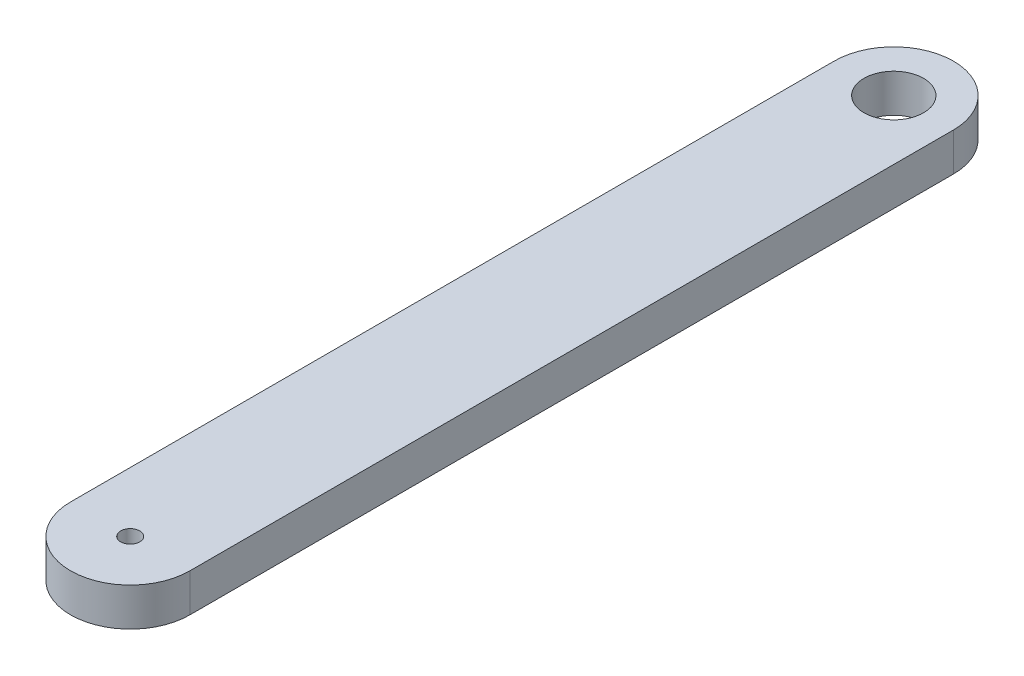
ISO-10303-21;
HEADER;
FILE_DESCRIPTION(('STEP AP214'),'2;1');
FILE_NAME('part.step','',(''),(''),'','','');
FILE_SCHEMA(('AUTOMOTIVE_DESIGN { 1 0 10303 214 1 1 1 1 }'));
ENDSEC;
DATA;
#1=APPLICATION_CONTEXT('core data for automotive mechanical design processes');
#2=APPLICATION_PROTOCOL_DEFINITION('international standard','automotive_design',2000,#1);
#3=PRODUCT_CONTEXT('',#1,'mechanical');
#4=PRODUCT('Part','Part','',(#3));
#5=PRODUCT_RELATED_PRODUCT_CATEGORY('part','',(#4));
#6=PRODUCT_DEFINITION_FORMATION('','',#4);
#7=PRODUCT_DEFINITION_CONTEXT('part definition',#1,'design');
#8=PRODUCT_DEFINITION('design','',#6,#7);
#9=PRODUCT_DEFINITION_SHAPE('','',#8);
#10=(LENGTH_UNIT() NAMED_UNIT(*) SI_UNIT(.MILLI.,.METRE.));
#11=(NAMED_UNIT(*) PLANE_ANGLE_UNIT() SI_UNIT($,.RADIAN.));
#12=(NAMED_UNIT(*) SI_UNIT($,.STERADIAN.) SOLID_ANGLE_UNIT());
#13=UNCERTAINTY_MEASURE_WITH_UNIT(LENGTH_MEASURE(1.E-05),#10,'distance_accuracy_value','');
#14=(GEOMETRIC_REPRESENTATION_CONTEXT(3) GLOBAL_UNCERTAINTY_ASSIGNED_CONTEXT((#13)) GLOBAL_UNIT_ASSIGNED_CONTEXT((#10,
#11,#12)) REPRESENTATION_CONTEXT('',''));
#15=CARTESIAN_POINT('',(0.,0.,0.));
#16=DIRECTION('',(0.,0.,1.));
#17=DIRECTION('',(1.,0.,0.));
#18=AXIS2_PLACEMENT_3D('',#15,#16,#17);
#19=CARTESIAN_POINT('',(12.5,8.,0.));
#20=DIRECTION('',(1.,0.,0.));
#21=DIRECTION('',(0.,0.,-1.));
#22=AXIS2_PLACEMENT_3D('',#19,#20,#21);
#23=PLANE('',#22);
#24=DIRECTION('',(0.,0.,1.));
#25=VECTOR('',#24,1.);
#26=CARTESIAN_POINT('',(12.5,0.,0.));
#27=LINE('',#26,#25);
#28=CARTESIAN_POINT('',(12.5,0.,-160.));
#29=VERTEX_POINT('',#28);
#30=CARTESIAN_POINT('',(12.5,0.,0.));
#31=VERTEX_POINT('',#30);
#32=EDGE_CURVE('E112',#29,#31,#27,.T.);
#33=ORIENTED_EDGE('',*,*,#32,.F.);
#34=DIRECTION('',(0.,-1.,0.));
#35=VECTOR('',#34,1.);
#36=CARTESIAN_POINT('',(12.5,8.,-160.));
#37=LINE('',#36,#35);
#38=CARTESIAN_POINT('',(12.5,8.,-160.));
#39=VERTEX_POINT('',#38);
#40=EDGE_CURVE('E11',#39,#29,#37,.T.);
#41=ORIENTED_EDGE('',*,*,#40,.F.);
#42=DIRECTION('',(0.,0.,1.));
#43=VECTOR('',#42,1.);
#44=CARTESIAN_POINT('',(12.5,8.,0.));
#45=LINE('',#44,#43);
#46=CARTESIAN_POINT('',(12.5,8.,0.));
#47=VERTEX_POINT('',#46);
#48=EDGE_CURVE('E98',#39,#47,#45,.T.);
#49=ORIENTED_EDGE('',*,*,#48,.T.);
#50=DIRECTION('',(0.,-1.,0.));
#51=VECTOR('',#50,1.);
#52=CARTESIAN_POINT('',(12.5,8.,0.));
#53=LINE('',#52,#51);
#54=EDGE_CURVE('E81',#47,#31,#53,.T.);
#55=ORIENTED_EDGE('',*,*,#54,.T.);
#56=EDGE_LOOP('',(#33,#41,#49,#55));
#57=FACE_BOUND('',#56,.T.);
#58=ADVANCED_FACE('F44',(#57),#23,.T.);
#59=CARTESIAN_POINT('',(0.,8.,-160.));
#60=DIRECTION('',(0.,-1.,0.));
#61=DIRECTION('',(0.,0.,-1.));
#62=AXIS2_PLACEMENT_3D('',#59,#60,#61);
#63=CYLINDRICAL_SURFACE('',#62,12.5);
#64=CARTESIAN_POINT('',(0.,0.,-160.));
#65=DIRECTION('',(0.,1.,0.));
#66=DIRECTION('',(0.,0.,1.));
#67=AXIS2_PLACEMENT_3D('',#64,#65,#66);
#68=CIRCLE('',#67,12.5);
#69=CARTESIAN_POINT('',(-12.5,0.,-160.));
#70=VERTEX_POINT('',#69);
#71=EDGE_CURVE('E103',#29,#70,#68,.T.);
#72=ORIENTED_EDGE('',*,*,#71,.T.);
#73=DIRECTION('',(0.,-1.,0.));
#74=VECTOR('',#73,1.);
#75=CARTESIAN_POINT('',(-12.5,8.,-160.));
#76=LINE('',#75,#74);
#77=CARTESIAN_POINT('',(-12.5,8.,-160.));
#78=VERTEX_POINT('',#77);
#79=EDGE_CURVE('E52',#78,#70,#76,.T.);
#80=ORIENTED_EDGE('',*,*,#79,.F.);
#81=CARTESIAN_POINT('',(0.,8.,-160.));
#82=DIRECTION('',(0.,1.,0.));
#83=DIRECTION('',(0.,0.,1.));
#84=AXIS2_PLACEMENT_3D('',#81,#82,#83);
#85=CIRCLE('',#84,12.5);
#86=EDGE_CURVE('E89',#39,#78,#85,.T.);
#87=ORIENTED_EDGE('',*,*,#86,.F.);
#88=ORIENTED_EDGE('',*,*,#40,.T.);
#89=EDGE_LOOP('',(#72,#80,#87,#88));
#90=FACE_BOUND('',#89,.T.);
#91=ADVANCED_FACE('F100',(#90),#63,.T.);
#92=CARTESIAN_POINT('',(-12.5,8.,0.));
#93=DIRECTION('',(1.,0.,0.));
#94=DIRECTION('',(0.,0.,-1.));
#95=AXIS2_PLACEMENT_3D('',#92,#93,#94);
#96=PLANE('',#95);
#97=DIRECTION('',(0.,0.,1.));
#98=VECTOR('',#97,1.);
#99=CARTESIAN_POINT('',(-12.5,0.,0.));
#100=LINE('',#99,#98);
#101=CARTESIAN_POINT('',(-12.5,0.,0.));
#102=VERTEX_POINT('',#101);
#103=EDGE_CURVE('E80',#70,#102,#100,.T.);
#104=ORIENTED_EDGE('',*,*,#103,.T.);
#105=DIRECTION('',(0.,-1.,0.));
#106=VECTOR('',#105,1.);
#107=CARTESIAN_POINT('',(-12.5,8.,0.));
#108=LINE('',#107,#106);
#109=CARTESIAN_POINT('',(-12.5,8.,0.));
#110=VERTEX_POINT('',#109);
#111=EDGE_CURVE('E105',#110,#102,#108,.T.);
#112=ORIENTED_EDGE('',*,*,#111,.F.);
#113=DIRECTION('',(0.,0.,1.));
#114=VECTOR('',#113,1.);
#115=CARTESIAN_POINT('',(-12.5,8.,0.));
#116=LINE('',#115,#114);
#117=EDGE_CURVE('E94',#78,#110,#116,.T.);
#118=ORIENTED_EDGE('',*,*,#117,.F.);
#119=ORIENTED_EDGE('',*,*,#79,.T.);
#120=EDGE_LOOP('',(#104,#112,#118,#119));
#121=FACE_BOUND('',#120,.T.);
#122=ADVANCED_FACE('F101',(#121),#96,.F.);
#123=CARTESIAN_POINT('',(0.,8.,0.));
#124=DIRECTION('',(0.,-1.,0.));
#125=DIRECTION('',(0.,0.,-1.));
#126=AXIS2_PLACEMENT_3D('',#123,#124,#125);
#127=CYLINDRICAL_SURFACE('',#126,2.);
#128=CARTESIAN_POINT('',(0.,8.,0.));
#129=DIRECTION('',(0.,1.,0.));
#130=DIRECTION('',(0.,0.,1.));
#131=AXIS2_PLACEMENT_3D('',#128,#129,#130);
#132=CIRCLE('',#131,2.);
#133=CARTESIAN_POINT('',(0.,8.,2.));
#134=VERTEX_POINT('',#133);
#135=EDGE_CURVE('E102',#134,#134,#132,.T.);
#136=ORIENTED_EDGE('',*,*,#135,.T.);
#137=EDGE_LOOP('',(#136));
#138=FACE_BOUND('',#137,.T.);
#139=CARTESIAN_POINT('',(0.,0.,0.));
#140=DIRECTION('',(0.,1.,0.));
#141=DIRECTION('',(0.,0.,1.));
#142=AXIS2_PLACEMENT_3D('',#139,#140,#141);
#143=CIRCLE('',#142,2.);
#144=CARTESIAN_POINT('',(0.,0.,2.));
#145=VERTEX_POINT('',#144);
#146=EDGE_CURVE('E122',#145,#145,#143,.T.);
#147=ORIENTED_EDGE('',*,*,#146,.F.);
#148=EDGE_LOOP('',(#147));
#149=FACE_BOUND('',#148,.T.);
#150=ADVANCED_FACE('F142',(#138,#149),#127,.F.);
#151=CARTESIAN_POINT('',(0.,8.,0.));
#152=DIRECTION('',(0.,-1.,0.));
#153=DIRECTION('',(0.,0.,-1.));
#154=AXIS2_PLACEMENT_3D('',#151,#152,#153);
#155=CYLINDRICAL_SURFACE('',#154,12.5);
#156=CARTESIAN_POINT('',(0.,0.,0.));
#157=DIRECTION('',(0.,1.,0.));
#158=DIRECTION('',(0.,0.,1.));
#159=AXIS2_PLACEMENT_3D('',#156,#157,#158);
#160=CIRCLE('',#159,12.5);
#161=EDGE_CURVE('E118',#102,#31,#160,.T.);
#162=ORIENTED_EDGE('',*,*,#161,.T.);
#163=ORIENTED_EDGE('',*,*,#54,.F.);
#164=CARTESIAN_POINT('',(0.,8.,0.));
#165=DIRECTION('',(0.,1.,0.));
#166=DIRECTION('',(0.,0.,1.));
#167=AXIS2_PLACEMENT_3D('',#164,#165,#166);
#168=CIRCLE('',#167,12.5);
#169=EDGE_CURVE('E62',#110,#47,#168,.T.);
#170=ORIENTED_EDGE('',*,*,#169,.F.);
#171=ORIENTED_EDGE('',*,*,#111,.T.);
#172=EDGE_LOOP('',(#162,#163,#170,#171));
#173=FACE_BOUND('',#172,.T.);
#174=ADVANCED_FACE('F128',(#173),#155,.T.);
#175=CARTESIAN_POINT('',(0.,8.,-160.));
#176=DIRECTION('',(0.,-1.,0.));
#177=DIRECTION('',(0.,0.,-1.));
#178=AXIS2_PLACEMENT_3D('',#175,#176,#177);
#179=CYLINDRICAL_SURFACE('',#178,6.25);
#180=CARTESIAN_POINT('',(0.,8.,-160.));
#181=DIRECTION('',(0.,1.,0.));
#182=DIRECTION('',(0.,0.,1.));
#183=AXIS2_PLACEMENT_3D('',#180,#181,#182);
#184=CIRCLE('',#183,6.25);
#185=CARTESIAN_POINT('',(0.,8.,-153.75));
#186=VERTEX_POINT('',#185);
#187=EDGE_CURVE('E111',#186,#186,#184,.T.);
#188=ORIENTED_EDGE('',*,*,#187,.T.);
#189=EDGE_LOOP('',(#188));
#190=FACE_BOUND('',#189,.T.);
#191=CARTESIAN_POINT('',(0.,0.,-160.));
#192=DIRECTION('',(0.,1.,0.));
#193=DIRECTION('',(0.,0.,1.));
#194=AXIS2_PLACEMENT_3D('',#191,#192,#193);
#195=CIRCLE('',#194,6.25);
#196=CARTESIAN_POINT('',(0.,0.,-153.75));
#197=VERTEX_POINT('',#196);
#198=EDGE_CURVE('E121',#197,#197,#195,.T.);
#199=ORIENTED_EDGE('',*,*,#198,.F.);
#200=EDGE_LOOP('',(#199));
#201=FACE_BOUND('',#200,.T.);
#202=ADVANCED_FACE('F147',(#190,#201),#179,.F.);
#203=CARTESIAN_POINT('',(0.,8.,0.));
#204=DIRECTION('',(0.,1.,0.));
#205=DIRECTION('',(0.,0.,1.));
#206=AXIS2_PLACEMENT_3D('',#203,#204,#205);
#207=PLANE('',#206);
#208=ORIENTED_EDGE('',*,*,#48,.F.);
#209=ORIENTED_EDGE('',*,*,#86,.T.);
#210=ORIENTED_EDGE('',*,*,#117,.T.);
#211=ORIENTED_EDGE('',*,*,#169,.T.);
#212=EDGE_LOOP('',(#208,#209,#210,#211));
#213=FACE_BOUND('',#212,.T.);
#214=ORIENTED_EDGE('',*,*,#135,.F.);
#215=EDGE_LOOP('',(#214));
#216=FACE_BOUND('',#215,.T.);
#217=ORIENTED_EDGE('',*,*,#187,.F.);
#218=EDGE_LOOP('',(#217));
#219=FACE_BOUND('',#218,.T.);
#220=ADVANCED_FACE('F95',(#213,#216,#219),#207,.T.);
#221=CARTESIAN_POINT('',(0.,0.,0.));
#222=DIRECTION('',(0.,1.,0.));
#223=DIRECTION('',(0.,0.,1.));
#224=AXIS2_PLACEMENT_3D('',#221,#222,#223);
#225=PLANE('',#224);
#226=ORIENTED_EDGE('',*,*,#32,.T.);
#227=ORIENTED_EDGE('',*,*,#161,.F.);
#228=ORIENTED_EDGE('',*,*,#103,.F.);
#229=ORIENTED_EDGE('',*,*,#71,.F.);
#230=EDGE_LOOP('',(#226,#227,#228,#229));
#231=FACE_BOUND('',#230,.T.);
#232=ORIENTED_EDGE('',*,*,#146,.T.);
#233=EDGE_LOOP('',(#232));
#234=FACE_BOUND('',#233,.T.);
#235=ORIENTED_EDGE('',*,*,#198,.T.);
#236=EDGE_LOOP('',(#235));
#237=FACE_BOUND('',#236,.T.);
#238=ADVANCED_FACE('F135',(#231,#234,#237),#225,.F.);
#239=CLOSED_SHELL('',(#58,#91,#122,#150,#174,#202,#220,#238));
#240=MANIFOLD_SOLID_BREP('B2',#239);
#241=ADVANCED_BREP_SHAPE_REPRESENTATION('',(#18,#240),#14);
#242=SHAPE_DEFINITION_REPRESENTATION(#9,#241);
ENDSEC;
END-ISO-10303-21;
